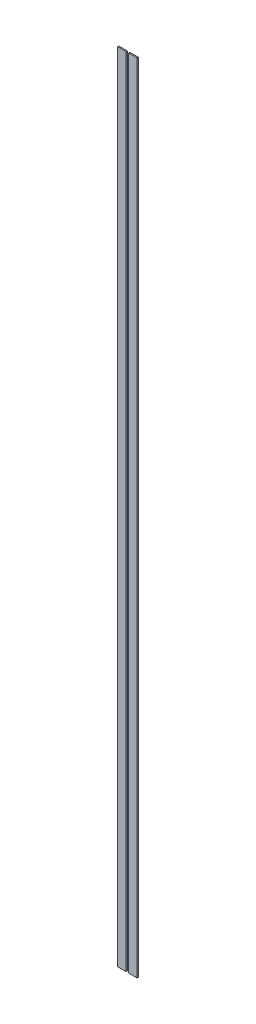
ISO-10303-21;
HEADER;
FILE_DESCRIPTION(('STEP AP214'),'2;1');
FILE_NAME('part.step','',(''),(''),'','','');
FILE_SCHEMA(('AUTOMOTIVE_DESIGN { 1 0 10303 214 1 1 1 1 }'));
ENDSEC;
DATA;
#1=APPLICATION_CONTEXT('core data for automotive mechanical design processes');
#2=APPLICATION_PROTOCOL_DEFINITION('international standard','automotive_design',2000,#1);
#3=PRODUCT_CONTEXT('',#1,'mechanical');
#4=PRODUCT('Part','Part','',(#3));
#5=PRODUCT_RELATED_PRODUCT_CATEGORY('part','',(#4));
#6=PRODUCT_DEFINITION_FORMATION('','',#4);
#7=PRODUCT_DEFINITION_CONTEXT('part definition',#1,'design');
#8=PRODUCT_DEFINITION('design','',#6,#7);
#9=PRODUCT_DEFINITION_SHAPE('','',#8);
#10=(LENGTH_UNIT() NAMED_UNIT(*) SI_UNIT(.MILLI.,.METRE.));
#11=(NAMED_UNIT(*) PLANE_ANGLE_UNIT() SI_UNIT($,.RADIAN.));
#12=(NAMED_UNIT(*) SI_UNIT($,.STERADIAN.) SOLID_ANGLE_UNIT());
#13=UNCERTAINTY_MEASURE_WITH_UNIT(LENGTH_MEASURE(1.E-05),#10,'distance_accuracy_value','');
#14=(GEOMETRIC_REPRESENTATION_CONTEXT(3) GLOBAL_UNCERTAINTY_ASSIGNED_CONTEXT((#13)) GLOBAL_UNIT_ASSIGNED_CONTEXT((#10,
#11,#12)) REPRESENTATION_CONTEXT('',''));
#15=CARTESIAN_POINT('',(0.,0.,0.));
#16=DIRECTION('',(0.,0.,1.));
#17=DIRECTION('',(1.,0.,0.));
#18=AXIS2_PLACEMENT_3D('',#15,#16,#17);
#19=CARTESIAN_POINT('',(7.99999999999998,380.,1.));
#20=DIRECTION('',(0.,-1.,0.));
#21=DIRECTION('',(0.,0.,-1.));
#22=AXIS2_PLACEMENT_3D('',#19,#20,#21);
#23=PLANE('',#22);
#24=DIRECTION('',(-1.,0.,0.));
#25=VECTOR('',#24,1.);
#26=CARTESIAN_POINT('',(7.99999999999998,380.,0.));
#27=LINE('',#26,#25);
#28=CARTESIAN_POINT('',(7.99999999999998,380.,0.));
#29=VERTEX_POINT('',#28);
#30=CARTESIAN_POINT('',(0.999999999999983,380.,0.));
#31=VERTEX_POINT('',#30);
#32=EDGE_CURVE('E89',#29,#31,#27,.T.);
#33=ORIENTED_EDGE('',*,*,#32,.T.);
#34=DIRECTION('',(0.,0.,-1.));
#35=VECTOR('',#34,1.);
#36=CARTESIAN_POINT('',(0.999999999999983,380.,1.));
#37=LINE('',#36,#35);
#38=CARTESIAN_POINT('',(0.999999999999983,380.,1.));
#39=VERTEX_POINT('',#38);
#40=EDGE_CURVE('E12',#39,#31,#37,.T.);
#41=ORIENTED_EDGE('',*,*,#40,.F.);
#42=DIRECTION('',(-1.,0.,0.));
#43=VECTOR('',#42,1.);
#44=CARTESIAN_POINT('',(7.99999999999998,380.,1.));
#45=LINE('',#44,#43);
#46=CARTESIAN_POINT('',(7.99999999999998,380.,1.));
#47=VERTEX_POINT('',#46);
#48=EDGE_CURVE('E107',#47,#39,#45,.T.);
#49=ORIENTED_EDGE('',*,*,#48,.F.);
#50=DIRECTION('',(0.,0.,-1.));
#51=VECTOR('',#50,1.);
#52=CARTESIAN_POINT('',(7.99999999999998,380.,1.));
#53=LINE('',#52,#51);
#54=EDGE_CURVE('E101',#47,#29,#53,.T.);
#55=ORIENTED_EDGE('',*,*,#54,.T.);
#56=EDGE_LOOP('',(#33,#41,#49,#55));
#57=FACE_BOUND('',#56,.T.);
#58=ADVANCED_FACE('F45',(#57),#23,.F.);
#59=CARTESIAN_POINT('',(0.999999999999983,380.,1.));
#60=DIRECTION('',(1.,0.,0.));
#61=DIRECTION('',(0.,1.,0.));
#62=AXIS2_PLACEMENT_3D('',#59,#60,#61);
#63=PLANE('',#62);
#64=DIRECTION('',(0.,-1.,0.));
#65=VECTOR('',#64,1.);
#66=CARTESIAN_POINT('',(0.999999999999983,380.,0.));
#67=LINE('',#66,#65);
#68=CARTESIAN_POINT('',(1.00000000000005,-280.,0.));
#69=VERTEX_POINT('',#68);
#70=EDGE_CURVE('E85',#31,#69,#67,.T.);
#71=ORIENTED_EDGE('',*,*,#70,.T.);
#72=DIRECTION('',(0.,0.,-1.));
#73=VECTOR('',#72,1.);
#74=CARTESIAN_POINT('',(1.00000000000005,-280.,1.));
#75=LINE('',#74,#73);
#76=CARTESIAN_POINT('',(1.00000000000005,-280.,1.));
#77=VERTEX_POINT('',#76);
#78=EDGE_CURVE('E52',#77,#69,#75,.T.);
#79=ORIENTED_EDGE('',*,*,#78,.F.);
#80=DIRECTION('',(0.,-1.,0.));
#81=VECTOR('',#80,1.);
#82=CARTESIAN_POINT('',(0.999999999999983,380.,1.));
#83=LINE('',#82,#81);
#84=EDGE_CURVE('E97',#39,#77,#83,.T.);
#85=ORIENTED_EDGE('',*,*,#84,.F.);
#86=ORIENTED_EDGE('',*,*,#40,.T.);
#87=EDGE_LOOP('',(#71,#79,#85,#86));
#88=FACE_BOUND('',#87,.T.);
#89=ADVANCED_FACE('F96',(#88),#63,.F.);
#90=CARTESIAN_POINT('',(8.00000000000002,-280.,1.));
#91=DIRECTION('',(0.,1.,0.));
#92=DIRECTION('',(0.,0.,1.));
#93=AXIS2_PLACEMENT_3D('',#90,#91,#92);
#94=PLANE('',#93);
#95=DIRECTION('',(1.,0.,0.));
#96=VECTOR('',#95,1.);
#97=CARTESIAN_POINT('',(8.00000000000002,-280.,0.));
#98=LINE('',#97,#96);
#99=CARTESIAN_POINT('',(8.00000000000002,-280.,0.));
#100=VERTEX_POINT('',#99);
#101=EDGE_CURVE('E90',#69,#100,#98,.T.);
#102=ORIENTED_EDGE('',*,*,#101,.T.);
#103=DIRECTION('',(0.,0.,-1.));
#104=VECTOR('',#103,1.);
#105=CARTESIAN_POINT('',(8.00000000000002,-280.,1.));
#106=LINE('',#105,#104);
#107=CARTESIAN_POINT('',(8.00000000000002,-280.,1.));
#108=VERTEX_POINT('',#107);
#109=EDGE_CURVE('E113',#108,#100,#106,.T.);
#110=ORIENTED_EDGE('',*,*,#109,.F.);
#111=DIRECTION('',(1.,0.,0.));
#112=VECTOR('',#111,1.);
#113=CARTESIAN_POINT('',(8.00000000000002,-280.,1.));
#114=LINE('',#113,#112);
#115=EDGE_CURVE('E64',#77,#108,#114,.T.);
#116=ORIENTED_EDGE('',*,*,#115,.F.);
#117=ORIENTED_EDGE('',*,*,#78,.T.);
#118=EDGE_LOOP('',(#102,#110,#116,#117));
#119=FACE_BOUND('',#118,.T.);
#120=ADVANCED_FACE('F116',(#119),#94,.F.);
#121=CARTESIAN_POINT('',(7.99999999999998,380.,1.));
#122=DIRECTION('',(-1.,0.,0.));
#123=DIRECTION('',(0.,-1.,0.));
#124=AXIS2_PLACEMENT_3D('',#121,#122,#123);
#125=PLANE('',#124);
#126=DIRECTION('',(0.,1.,0.));
#127=VECTOR('',#126,1.);
#128=CARTESIAN_POINT('',(7.99999999999998,380.,0.));
#129=LINE('',#128,#127);
#130=EDGE_CURVE('E105',#100,#29,#129,.T.);
#131=ORIENTED_EDGE('',*,*,#130,.T.);
#132=ORIENTED_EDGE('',*,*,#54,.F.);
#133=DIRECTION('',(0.,1.,0.));
#134=VECTOR('',#133,1.);
#135=CARTESIAN_POINT('',(7.99999999999998,380.,1.));
#136=LINE('',#135,#134);
#137=EDGE_CURVE('E59',#108,#47,#136,.T.);
#138=ORIENTED_EDGE('',*,*,#137,.F.);
#139=ORIENTED_EDGE('',*,*,#109,.T.);
#140=EDGE_LOOP('',(#131,#132,#138,#139));
#141=FACE_BOUND('',#140,.T.);
#142=ADVANCED_FACE('F118',(#141),#125,.F.);
#143=CARTESIAN_POINT('',(7.99999999999998,380.,1.));
#144=DIRECTION('',(0.,0.,1.));
#145=DIRECTION('',(1.,0.,0.));
#146=AXIS2_PLACEMENT_3D('',#143,#144,#145);
#147=PLANE('',#146);
#148=ORIENTED_EDGE('',*,*,#48,.T.);
#149=ORIENTED_EDGE('',*,*,#84,.T.);
#150=ORIENTED_EDGE('',*,*,#115,.T.);
#151=ORIENTED_EDGE('',*,*,#137,.T.);
#152=EDGE_LOOP('',(#148,#149,#150,#151));
#153=FACE_BOUND('',#152,.T.);
#154=ADVANCED_FACE('F119',(#153),#147,.T.);
#155=CARTESIAN_POINT('',(7.99999999999998,380.,0.));
#156=DIRECTION('',(0.,0.,1.));
#157=DIRECTION('',(1.,0.,0.));
#158=AXIS2_PLACEMENT_3D('',#155,#156,#157);
#159=PLANE('',#158);
#160=ORIENTED_EDGE('',*,*,#32,.F.);
#161=ORIENTED_EDGE('',*,*,#130,.F.);
#162=ORIENTED_EDGE('',*,*,#101,.F.);
#163=ORIENTED_EDGE('',*,*,#70,.F.);
#164=EDGE_LOOP('',(#160,#161,#162,#163));
#165=FACE_BOUND('',#164,.T.);
#166=ADVANCED_FACE('F86',(#165),#159,.F.);
#167=CLOSED_SHELL('',(#58,#89,#120,#142,#154,#166));
#168=MANIFOLD_SOLID_BREP('B2',#167);
#169=CARTESIAN_POINT('',(-7.99999999999998,380.,1.));
#170=DIRECTION('',(1.,0.,0.));
#171=DIRECTION('',(0.,1.,0.));
#172=AXIS2_PLACEMENT_3D('',#169,#170,#171);
#173=PLANE('',#172);
#174=DIRECTION('',(0.,-1.,0.));
#175=VECTOR('',#174,1.);
#176=CARTESIAN_POINT('',(-7.99999999999998,380.,0.));
#177=LINE('',#176,#175);
#178=CARTESIAN_POINT('',(-7.99999999999998,380.,0.));
#179=VERTEX_POINT('',#178);
#180=CARTESIAN_POINT('',(-8.00000000000002,-280.,0.));
#181=VERTEX_POINT('',#180);
#182=EDGE_CURVE('E213',#179,#181,#177,.T.);
#183=ORIENTED_EDGE('',*,*,#182,.T.);
#184=DIRECTION('',(0.,0.,-1.));
#185=VECTOR('',#184,1.);
#186=CARTESIAN_POINT('',(-8.00000000000002,-280.,1.));
#187=LINE('',#186,#185);
#188=CARTESIAN_POINT('',(-8.00000000000002,-280.,1.));
#189=VERTEX_POINT('',#188);
#190=EDGE_CURVE('E43',#189,#181,#187,.T.);
#191=ORIENTED_EDGE('',*,*,#190,.F.);
#192=DIRECTION('',(0.,-1.,0.));
#193=VECTOR('',#192,1.);
#194=CARTESIAN_POINT('',(-7.99999999999998,380.,1.));
#195=LINE('',#194,#193);
#196=CARTESIAN_POINT('',(-7.99999999999998,380.,1.));
#197=VERTEX_POINT('',#196);
#198=EDGE_CURVE('E231',#197,#189,#195,.T.);
#199=ORIENTED_EDGE('',*,*,#198,.F.);
#200=DIRECTION('',(0.,0.,-1.));
#201=VECTOR('',#200,1.);
#202=CARTESIAN_POINT('',(-7.99999999999998,380.,1.));
#203=LINE('',#202,#201);
#204=EDGE_CURVE('E225',#197,#179,#203,.T.);
#205=ORIENTED_EDGE('',*,*,#204,.T.);
#206=EDGE_LOOP('',(#183,#191,#199,#205));
#207=FACE_BOUND('',#206,.T.);
#208=ADVANCED_FACE('F169',(#207),#173,.F.);
#209=CARTESIAN_POINT('',(-8.00000000000002,-280.,1.));
#210=DIRECTION('',(0.,1.,0.));
#211=DIRECTION('',(0.,0.,1.));
#212=AXIS2_PLACEMENT_3D('',#209,#210,#211);
#213=PLANE('',#212);
#214=DIRECTION('',(1.,0.,0.));
#215=VECTOR('',#214,1.);
#216=CARTESIAN_POINT('',(-8.00000000000002,-280.,0.));
#217=LINE('',#216,#215);
#218=CARTESIAN_POINT('',(-1.00000000000005,-280.,0.));
#219=VERTEX_POINT('',#218);
#220=EDGE_CURVE('E209',#181,#219,#217,.T.);
#221=ORIENTED_EDGE('',*,*,#220,.T.);
#222=DIRECTION('',(0.,0.,-1.));
#223=VECTOR('',#222,1.);
#224=CARTESIAN_POINT('',(-1.00000000000005,-280.,1.));
#225=LINE('',#224,#223);
#226=CARTESIAN_POINT('',(-1.00000000000005,-280.,1.));
#227=VERTEX_POINT('',#226);
#228=EDGE_CURVE('E176',#227,#219,#225,.T.);
#229=ORIENTED_EDGE('',*,*,#228,.F.);
#230=DIRECTION('',(1.,0.,0.));
#231=VECTOR('',#230,1.);
#232=CARTESIAN_POINT('',(-8.00000000000002,-280.,1.));
#233=LINE('',#232,#231);
#234=EDGE_CURVE('E221',#189,#227,#233,.T.);
#235=ORIENTED_EDGE('',*,*,#234,.F.);
#236=ORIENTED_EDGE('',*,*,#190,.T.);
#237=EDGE_LOOP('',(#221,#229,#235,#236));
#238=FACE_BOUND('',#237,.T.);
#239=ADVANCED_FACE('F220',(#238),#213,.F.);
#240=CARTESIAN_POINT('',(-0.999999999999983,380.,1.));
#241=DIRECTION('',(-1.,0.,0.));
#242=DIRECTION('',(0.,-1.,0.));
#243=AXIS2_PLACEMENT_3D('',#240,#241,#242);
#244=PLANE('',#243);
#245=DIRECTION('',(0.,1.,0.));
#246=VECTOR('',#245,1.);
#247=CARTESIAN_POINT('',(-0.999999999999983,380.,0.));
#248=LINE('',#247,#246);
#249=CARTESIAN_POINT('',(-0.999999999999983,380.,0.));
#250=VERTEX_POINT('',#249);
#251=EDGE_CURVE('E214',#219,#250,#248,.T.);
#252=ORIENTED_EDGE('',*,*,#251,.T.);
#253=DIRECTION('',(0.,0.,-1.));
#254=VECTOR('',#253,1.);
#255=CARTESIAN_POINT('',(-0.999999999999983,380.,1.));
#256=LINE('',#255,#254);
#257=CARTESIAN_POINT('',(-0.999999999999983,380.,1.));
#258=VERTEX_POINT('',#257);
#259=EDGE_CURVE('E237',#258,#250,#256,.T.);
#260=ORIENTED_EDGE('',*,*,#259,.F.);
#261=DIRECTION('',(0.,1.,0.));
#262=VECTOR('',#261,1.);
#263=CARTESIAN_POINT('',(-0.999999999999983,380.,1.));
#264=LINE('',#263,#262);
#265=EDGE_CURVE('E188',#227,#258,#264,.T.);
#266=ORIENTED_EDGE('',*,*,#265,.F.);
#267=ORIENTED_EDGE('',*,*,#228,.T.);
#268=EDGE_LOOP('',(#252,#260,#266,#267));
#269=FACE_BOUND('',#268,.T.);
#270=ADVANCED_FACE('F240',(#269),#244,.F.);
#271=CARTESIAN_POINT('',(-7.99999999999998,380.,1.));
#272=DIRECTION('',(0.,-1.,0.));
#273=DIRECTION('',(0.,0.,-1.));
#274=AXIS2_PLACEMENT_3D('',#271,#272,#273);
#275=PLANE('',#274);
#276=DIRECTION('',(-1.,0.,0.));
#277=VECTOR('',#276,1.);
#278=CARTESIAN_POINT('',(-7.99999999999998,380.,0.));
#279=LINE('',#278,#277);
#280=EDGE_CURVE('E229',#250,#179,#279,.T.);
#281=ORIENTED_EDGE('',*,*,#280,.T.);
#282=ORIENTED_EDGE('',*,*,#204,.F.);
#283=DIRECTION('',(-1.,0.,0.));
#284=VECTOR('',#283,1.);
#285=CARTESIAN_POINT('',(-7.99999999999998,380.,1.));
#286=LINE('',#285,#284);
#287=EDGE_CURVE('E183',#258,#197,#286,.T.);
#288=ORIENTED_EDGE('',*,*,#287,.F.);
#289=ORIENTED_EDGE('',*,*,#259,.T.);
#290=EDGE_LOOP('',(#281,#282,#288,#289));
#291=FACE_BOUND('',#290,.T.);
#292=ADVANCED_FACE('F242',(#291),#275,.F.);
#293=CARTESIAN_POINT('',(-8.00000000000002,-280.,1.));
#294=DIRECTION('',(0.,0.,1.));
#295=DIRECTION('',(1.,0.,0.));
#296=AXIS2_PLACEMENT_3D('',#293,#294,#295);
#297=PLANE('',#296);
#298=ORIENTED_EDGE('',*,*,#198,.T.);
#299=ORIENTED_EDGE('',*,*,#234,.T.);
#300=ORIENTED_EDGE('',*,*,#265,.T.);
#301=ORIENTED_EDGE('',*,*,#287,.T.);
#302=EDGE_LOOP('',(#298,#299,#300,#301));
#303=FACE_BOUND('',#302,.T.);
#304=ADVANCED_FACE('F243',(#303),#297,.T.);
#305=CARTESIAN_POINT('',(-8.00000000000002,-280.,0.));
#306=DIRECTION('',(0.,0.,1.));
#307=DIRECTION('',(1.,0.,0.));
#308=AXIS2_PLACEMENT_3D('',#305,#306,#307);
#309=PLANE('',#308);
#310=ORIENTED_EDGE('',*,*,#182,.F.);
#311=ORIENTED_EDGE('',*,*,#280,.F.);
#312=ORIENTED_EDGE('',*,*,#251,.F.);
#313=ORIENTED_EDGE('',*,*,#220,.F.);
#314=EDGE_LOOP('',(#310,#311,#312,#313));
#315=FACE_BOUND('',#314,.T.);
#316=ADVANCED_FACE('F210',(#315),#309,.F.);
#317=CLOSED_SHELL('',(#208,#239,#270,#292,#304,#316));
#318=MANIFOLD_SOLID_BREP('B6',#317);
#319=ADVANCED_BREP_SHAPE_REPRESENTATION('',(#18,#168,#318),#14);
#320=SHAPE_DEFINITION_REPRESENTATION(#9,#319);
ENDSEC;
END-ISO-10303-21;
